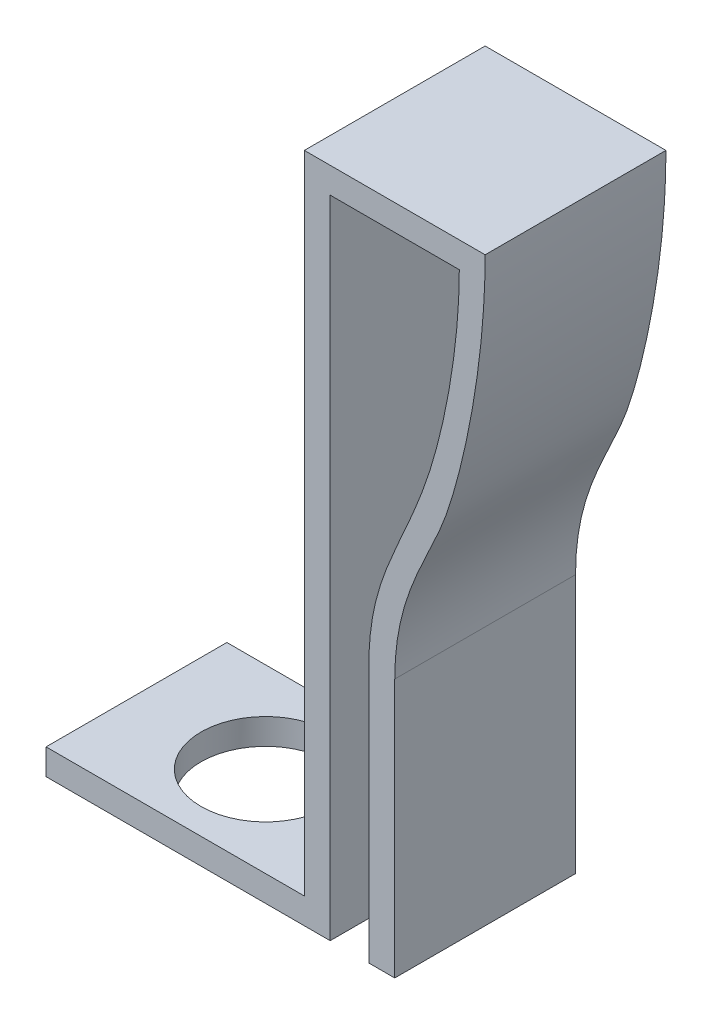
ISO-10303-21;
HEADER;
FILE_DESCRIPTION(('STEP AP214'),'2;1');
FILE_NAME('part.step','',(''),(''),'','','');
FILE_SCHEMA(('AUTOMOTIVE_DESIGN { 1 0 10303 214 1 1 1 1 }'));
ENDSEC;
DATA;
#1=APPLICATION_CONTEXT('core data for automotive mechanical design processes');
#2=APPLICATION_PROTOCOL_DEFINITION('international standard','automotive_design',2000,#1);
#3=PRODUCT_CONTEXT('',#1,'mechanical');
#4=PRODUCT('Part','Part','',(#3));
#5=PRODUCT_RELATED_PRODUCT_CATEGORY('part','',(#4));
#6=PRODUCT_DEFINITION_FORMATION('','',#4);
#7=PRODUCT_DEFINITION_CONTEXT('part definition',#1,'design');
#8=PRODUCT_DEFINITION('design','',#6,#7);
#9=PRODUCT_DEFINITION_SHAPE('','',#8);
#10=(LENGTH_UNIT() NAMED_UNIT(*) SI_UNIT(.MILLI.,.METRE.));
#11=(NAMED_UNIT(*) PLANE_ANGLE_UNIT() SI_UNIT($,.RADIAN.));
#12=(NAMED_UNIT(*) SI_UNIT($,.STERADIAN.) SOLID_ANGLE_UNIT());
#13=UNCERTAINTY_MEASURE_WITH_UNIT(LENGTH_MEASURE(1.E-05),#10,'distance_accuracy_value','');
#14=(GEOMETRIC_REPRESENTATION_CONTEXT(3) GLOBAL_UNCERTAINTY_ASSIGNED_CONTEXT((#13)) GLOBAL_UNIT_ASSIGNED_CONTEXT((#10,
#11,#12)) REPRESENTATION_CONTEXT('',''));
#15=CARTESIAN_POINT('',(0.,0.,0.));
#16=DIRECTION('',(0.,0.,1.));
#17=DIRECTION('',(1.,0.,0.));
#18=AXIS2_PLACEMENT_3D('',#15,#16,#17);
#19=CARTESIAN_POINT('',(0.,0.,7.));
#20=DIRECTION('',(-1.,0.,0.));
#21=DIRECTION('',(0.,0.,1.));
#22=AXIS2_PLACEMENT_3D('',#19,#20,#21);
#23=PLANE('',#22);
#24=DIRECTION('',(0.,1.,0.));
#25=VECTOR('',#24,1.);
#26=CARTESIAN_POINT('',(0.,0.,0.));
#27=LINE('',#26,#25);
#28=CARTESIAN_POINT('',(0.,0.,0.));
#29=VERTEX_POINT('',#28);
#30=CARTESIAN_POINT('',(0.,25.,0.));
#31=VERTEX_POINT('',#30);
#32=EDGE_CURVE('E158',#29,#31,#27,.T.);
#33=ORIENTED_EDGE('',*,*,#32,.T.);
#34=DIRECTION('',(0.,0.,-1.));
#35=VECTOR('',#34,1.);
#36=CARTESIAN_POINT('',(0.,25.,7.));
#37=LINE('',#36,#35);
#38=CARTESIAN_POINT('',(0.,25.,7.));
#39=VERTEX_POINT('',#38);
#40=EDGE_CURVE('E42',#39,#31,#37,.T.);
#41=ORIENTED_EDGE('',*,*,#40,.F.);
#42=DIRECTION('',(0.,1.,0.));
#43=VECTOR('',#42,1.);
#44=CARTESIAN_POINT('',(0.,0.,7.));
#45=LINE('',#44,#43);
#46=CARTESIAN_POINT('',(0.,0.,7.));
#47=VERTEX_POINT('',#46);
#48=EDGE_CURVE('E106',#47,#39,#45,.T.);
#49=ORIENTED_EDGE('',*,*,#48,.F.);
#50=DIRECTION('',(0.,0.,-1.));
#51=VECTOR('',#50,1.);
#52=CARTESIAN_POINT('',(0.,0.,7.));
#53=LINE('',#52,#51);
#54=EDGE_CURVE('E11',#47,#29,#53,.T.);
#55=ORIENTED_EDGE('',*,*,#54,.T.);
#56=EDGE_LOOP('',(#33,#41,#49,#55));
#57=FACE_BOUND('',#56,.T.);
#58=ADVANCED_FACE('F33',(#57),#23,.F.);
#59=CARTESIAN_POINT('',(0.,25.,7.));
#60=DIRECTION('',(0.,1.,0.));
#61=DIRECTION('',(0.,0.,1.));
#62=AXIS2_PLACEMENT_3D('',#59,#60,#61);
#63=PLANE('',#62);
#64=DIRECTION('',(1.,0.,0.));
#65=VECTOR('',#64,1.);
#66=CARTESIAN_POINT('',(0.,25.,0.));
#67=LINE('',#66,#65);
#68=CARTESIAN_POINT('',(5.,25.,0.));
#69=VERTEX_POINT('',#68);
#70=EDGE_CURVE('E160',#31,#69,#67,.T.);
#71=ORIENTED_EDGE('',*,*,#70,.T.);
#72=DIRECTION('',(0.,0.,-1.));
#73=VECTOR('',#72,1.);
#74=CARTESIAN_POINT('',(5.,25.,7.));
#75=LINE('',#74,#73);
#76=CARTESIAN_POINT('',(5.,25.,7.));
#77=VERTEX_POINT('',#76);
#78=EDGE_CURVE('E207',#77,#69,#75,.T.);
#79=ORIENTED_EDGE('',*,*,#78,.F.);
#80=DIRECTION('',(1.,0.,0.));
#81=VECTOR('',#80,1.);
#82=CARTESIAN_POINT('',(0.,25.,7.));
#83=LINE('',#82,#81);
#84=EDGE_CURVE('E216',#39,#77,#83,.T.);
#85=ORIENTED_EDGE('',*,*,#84,.F.);
#86=ORIENTED_EDGE('',*,*,#40,.T.);
#87=EDGE_LOOP('',(#71,#79,#85,#86));
#88=FACE_BOUND('',#87,.T.);
#89=ADVANCED_FACE('F214',(#88),#63,.F.);
#90=CARTESIAN_POINT('',(5.,25.,7.));
#91=CARTESIAN_POINT('',(5.,22.5051608538864,7.));
#92=CARTESIAN_POINT('',(3.77515363716571,15.5440274872174,7.));
#93=CARTESIAN_POINT('',(1.5,13.1602402129723,7.));
#94=CARTESIAN_POINT('',(1.5,10.,7.));
#95=B_SPLINE_CURVE_WITH_KNOTS('',3,(#90,#91,#92,#93,#94),.UNSPECIFIED.,.F.,.F.,(4,1,4),(0.,
0.413095147680513,1.),.UNSPECIFIED.);
#96=DIRECTION('',(0.,0.,-1.));
#97=VECTOR('',#96,1.);
#98=SURFACE_OF_LINEAR_EXTRUSION('',#95,#97);
#99=CARTESIAN_POINT('',(5.,25.,0.));
#100=CARTESIAN_POINT('',(5.,22.5051608538864,0.));
#101=CARTESIAN_POINT('',(3.77515363716571,15.5440274872174,0.));
#102=CARTESIAN_POINT('',(1.5,13.1602402129723,0.));
#103=CARTESIAN_POINT('',(1.5,10.,0.));
#104=B_SPLINE_CURVE_WITH_KNOTS('',3,(#99,#100,#101,#102,#103),.UNSPECIFIED.,.F.,.F.,(4,1,4),(0.,
0.413095147680513,1.),.UNSPECIFIED.);
#105=CARTESIAN_POINT('',(1.5,10.,0.));
#106=VERTEX_POINT('',#105);
#107=EDGE_CURVE('E162',#69,#106,#104,.T.);
#108=ORIENTED_EDGE('',*,*,#107,.T.);
#109=DIRECTION('',(0.,0.,-1.));
#110=VECTOR('',#109,1.);
#111=CARTESIAN_POINT('',(1.5,10.,7.));
#112=LINE('',#111,#110);
#113=CARTESIAN_POINT('',(1.5,10.,7.));
#114=VERTEX_POINT('',#113);
#115=EDGE_CURVE('E204',#114,#106,#112,.T.);
#116=ORIENTED_EDGE('',*,*,#115,.F.);
#117=EDGE_CURVE('E235',#77,#114,#95,.T.);
#118=ORIENTED_EDGE('',*,*,#117,.F.);
#119=ORIENTED_EDGE('',*,*,#78,.T.);
#120=EDGE_LOOP('',(#108,#116,#118,#119));
#121=FACE_BOUND('',#120,.T.);
#122=ADVANCED_FACE('F226',(#121),#98,.F.);
#123=CARTESIAN_POINT('',(1.5,0.,7.));
#124=DIRECTION('',(1.,0.,0.));
#125=DIRECTION('',(0.,0.,-1.));
#126=AXIS2_PLACEMENT_3D('',#123,#124,#125);
#127=PLANE('',#126);
#128=DIRECTION('',(0.,-1.,0.));
#129=VECTOR('',#128,1.);
#130=CARTESIAN_POINT('',(1.5,0.,0.));
#131=LINE('',#130,#129);
#132=CARTESIAN_POINT('',(1.5,0.,0.));
#133=VERTEX_POINT('',#132);
#134=EDGE_CURVE('E166',#106,#133,#131,.T.);
#135=ORIENTED_EDGE('',*,*,#134,.T.);
#136=DIRECTION('',(0.,0.,-1.));
#137=VECTOR('',#136,1.);
#138=CARTESIAN_POINT('',(1.5,0.,7.));
#139=LINE('',#138,#137);
#140=CARTESIAN_POINT('',(1.5,0.,7.));
#141=VERTEX_POINT('',#140);
#142=EDGE_CURVE('E201',#141,#133,#139,.T.);
#143=ORIENTED_EDGE('',*,*,#142,.F.);
#144=DIRECTION('',(0.,-1.,0.));
#145=VECTOR('',#144,1.);
#146=CARTESIAN_POINT('',(1.5,0.,7.));
#147=LINE('',#146,#145);
#148=EDGE_CURVE('E232',#114,#141,#147,.T.);
#149=ORIENTED_EDGE('',*,*,#148,.F.);
#150=ORIENTED_EDGE('',*,*,#115,.T.);
#151=EDGE_LOOP('',(#135,#143,#149,#150));
#152=FACE_BOUND('',#151,.T.);
#153=ADVANCED_FACE('F230',(#152),#127,.F.);
#154=CARTESIAN_POINT('',(1.5,0.,7.));
#155=DIRECTION('',(0.,1.,0.));
#156=DIRECTION('',(0.,0.,1.));
#157=AXIS2_PLACEMENT_3D('',#154,#155,#156);
#158=PLANE('',#157);
#159=DIRECTION('',(1.,0.,0.));
#160=VECTOR('',#159,1.);
#161=CARTESIAN_POINT('',(1.5,0.,0.));
#162=LINE('',#161,#160);
#163=CARTESIAN_POINT('',(2.5,0.,0.));
#164=VERTEX_POINT('',#163);
#165=EDGE_CURVE('E171',#133,#164,#162,.T.);
#166=ORIENTED_EDGE('',*,*,#165,.T.);
#167=DIRECTION('',(0.,0.,-1.));
#168=VECTOR('',#167,1.);
#169=CARTESIAN_POINT('',(2.5,0.,7.));
#170=LINE('',#169,#168);
#171=CARTESIAN_POINT('',(2.5,0.,7.));
#172=VERTEX_POINT('',#171);
#173=EDGE_CURVE('E198',#172,#164,#170,.T.);
#174=ORIENTED_EDGE('',*,*,#173,.F.);
#175=DIRECTION('',(1.,0.,0.));
#176=VECTOR('',#175,1.);
#177=CARTESIAN_POINT('',(1.5,0.,7.));
#178=LINE('',#177,#176);
#179=EDGE_CURVE('E234',#141,#172,#178,.T.);
#180=ORIENTED_EDGE('',*,*,#179,.F.);
#181=ORIENTED_EDGE('',*,*,#142,.T.);
#182=EDGE_LOOP('',(#166,#174,#180,#181));
#183=FACE_BOUND('',#182,.T.);
#184=ADVANCED_FACE('F264',(#183),#158,.F.);
#185=CARTESIAN_POINT('',(2.5,0.,7.));
#186=DIRECTION('',(-1.,0.,0.));
#187=DIRECTION('',(0.,0.,1.));
#188=AXIS2_PLACEMENT_3D('',#185,#186,#187);
#189=PLANE('',#188);
#190=DIRECTION('',(0.,1.,0.));
#191=VECTOR('',#190,1.);
#192=CARTESIAN_POINT('',(2.5,0.,0.));
#193=LINE('',#192,#191);
#194=CARTESIAN_POINT('',(2.5,10.0239728072315,0.));
#195=VERTEX_POINT('',#194);
#196=EDGE_CURVE('E173',#164,#195,#193,.T.);
#197=ORIENTED_EDGE('',*,*,#196,.T.);
#198=DIRECTION('',(0.,0.,-1.));
#199=VECTOR('',#198,1.);
#200=CARTESIAN_POINT('',(2.5,10.0239728072315,7.));
#201=LINE('',#200,#199);
#202=CARTESIAN_POINT('',(2.5,10.0239728072315,7.));
#203=VERTEX_POINT('',#202);
#204=EDGE_CURVE('E195',#203,#195,#201,.T.);
#205=ORIENTED_EDGE('',*,*,#204,.F.);
#206=DIRECTION('',(0.,1.,0.));
#207=VECTOR('',#206,1.);
#208=CARTESIAN_POINT('',(2.5,0.,7.));
#209=LINE('',#208,#207);
#210=EDGE_CURVE('E237',#172,#203,#209,.T.);
#211=ORIENTED_EDGE('',*,*,#210,.F.);
#212=ORIENTED_EDGE('',*,*,#173,.T.);
#213=EDGE_LOOP('',(#197,#205,#211,#212));
#214=FACE_BOUND('',#213,.T.);
#215=ADVANCED_FACE('F259',(#214),#189,.F.);
#216=CARTESIAN_POINT('',(2.5,10.0239728072315,7.));
#217=CARTESIAN_POINT('',(2.5,12.6969260185003,7.));
#218=CARTESIAN_POINT('',(3.79077686643129,14.6525962398853,7.));
#219=CARTESIAN_POINT('',(5.04127526822333,17.9714001978499,7.));
#220=CARTESIAN_POINT('',(6.,22.3223853433308,7.));
#221=CARTESIAN_POINT('',(6.,26.,7.));
#222=B_SPLINE_CURVE_WITH_KNOTS('',3,(#216,#217,#218,#219,#220,#221),.UNSPECIFIED.,.F.,.F.,(4,1,
1,4),(0.,0.473306407513653,0.573306407513653,1.),.UNSPECIFIED.);
#223=DIRECTION('',(0.,0.,-1.));
#224=VECTOR('',#223,1.);
#225=SURFACE_OF_LINEAR_EXTRUSION('',#222,#224);
#226=CARTESIAN_POINT('',(2.5,10.0239728072315,0.));
#227=CARTESIAN_POINT('',(2.5,12.6969260185003,0.));
#228=CARTESIAN_POINT('',(3.79077686643129,14.6525962398853,0.));
#229=CARTESIAN_POINT('',(5.04127526822333,17.9714001978499,0.));
#230=CARTESIAN_POINT('',(6.,22.3223853433308,0.));
#231=CARTESIAN_POINT('',(6.,26.,0.));
#232=B_SPLINE_CURVE_WITH_KNOTS('',3,(#226,#227,#228,#229,#230,#231),.UNSPECIFIED.,.F.,.F.,(4,1,
1,4),(0.,0.473306407513653,0.573306407513653,1.),.UNSPECIFIED.);
#233=CARTESIAN_POINT('',(6.,26.,0.));
#234=VERTEX_POINT('',#233);
#235=EDGE_CURVE('E175',#195,#234,#232,.T.);
#236=ORIENTED_EDGE('',*,*,#235,.T.);
#237=DIRECTION('',(0.,0.,-1.));
#238=VECTOR('',#237,1.);
#239=CARTESIAN_POINT('',(6.,26.,7.));
#240=LINE('',#239,#238);
#241=CARTESIAN_POINT('',(6.,26.,7.));
#242=VERTEX_POINT('',#241);
#243=EDGE_CURVE('E192',#242,#234,#240,.T.);
#244=ORIENTED_EDGE('',*,*,#243,.F.);
#245=EDGE_CURVE('E246',#203,#242,#222,.T.);
#246=ORIENTED_EDGE('',*,*,#245,.F.);
#247=ORIENTED_EDGE('',*,*,#204,.T.);
#248=EDGE_LOOP('',(#236,#244,#246,#247));
#249=FACE_BOUND('',#248,.T.);
#250=ADVANCED_FACE('F254',(#249),#225,.F.);
#251=CARTESIAN_POINT('',(-1.,26.,7.));
#252=DIRECTION('',(0.,-1.,0.));
#253=DIRECTION('',(0.,0.,-1.));
#254=AXIS2_PLACEMENT_3D('',#251,#252,#253);
#255=PLANE('',#254);
#256=DIRECTION('',(-1.,0.,0.));
#257=VECTOR('',#256,1.);
#258=CARTESIAN_POINT('',(-1.,26.,0.));
#259=LINE('',#258,#257);
#260=CARTESIAN_POINT('',(-1.,26.,0.));
#261=VERTEX_POINT('',#260);
#262=EDGE_CURVE('E179',#234,#261,#259,.T.);
#263=ORIENTED_EDGE('',*,*,#262,.T.);
#264=DIRECTION('',(0.,0.,-1.));
#265=VECTOR('',#264,1.);
#266=CARTESIAN_POINT('',(-1.,26.,7.));
#267=LINE('',#266,#265);
#268=CARTESIAN_POINT('',(-1.,26.,7.));
#269=VERTEX_POINT('',#268);
#270=EDGE_CURVE('E147',#269,#261,#267,.T.);
#271=ORIENTED_EDGE('',*,*,#270,.F.);
#272=DIRECTION('',(-1.,0.,0.));
#273=VECTOR('',#272,1.);
#274=CARTESIAN_POINT('',(-1.,26.,7.));
#275=LINE('',#274,#273);
#276=EDGE_CURVE('E138',#242,#269,#275,.T.);
#277=ORIENTED_EDGE('',*,*,#276,.F.);
#278=ORIENTED_EDGE('',*,*,#243,.T.);
#279=EDGE_LOOP('',(#263,#271,#277,#278));
#280=FACE_BOUND('',#279,.T.);
#281=ADVANCED_FACE('F258',(#280),#255,.F.);
#282=CARTESIAN_POINT('',(-1.,26.,7.));
#283=DIRECTION('',(1.,0.,0.));
#284=DIRECTION('',(0.,0.,-1.));
#285=AXIS2_PLACEMENT_3D('',#282,#283,#284);
#286=PLANE('',#285);
#287=DIRECTION('',(0.,-1.,0.));
#288=VECTOR('',#287,1.);
#289=CARTESIAN_POINT('',(-1.,26.,0.));
#290=LINE('',#289,#288);
#291=CARTESIAN_POINT('',(-1.,0.999999999999999,0.));
#292=VERTEX_POINT('',#291);
#293=EDGE_CURVE('E146',#261,#292,#290,.T.);
#294=ORIENTED_EDGE('',*,*,#293,.T.);
#295=DIRECTION('',(0.,0.,-1.));
#296=VECTOR('',#295,1.);
#297=CARTESIAN_POINT('',(-1.,0.999999999999999,7.));
#298=LINE('',#297,#296);
#299=CARTESIAN_POINT('',(-1.,0.999999999999999,7.));
#300=VERTEX_POINT('',#299);
#301=EDGE_CURVE('E143',#300,#292,#298,.T.);
#302=ORIENTED_EDGE('',*,*,#301,.F.);
#303=DIRECTION('',(0.,-1.,0.));
#304=VECTOR('',#303,1.);
#305=CARTESIAN_POINT('',(-1.,26.,7.));
#306=LINE('',#305,#304);
#307=EDGE_CURVE('E132',#269,#300,#306,.T.);
#308=ORIENTED_EDGE('',*,*,#307,.F.);
#309=ORIENTED_EDGE('',*,*,#270,.T.);
#310=EDGE_LOOP('',(#294,#302,#308,#309));
#311=FACE_BOUND('',#310,.T.);
#312=ADVANCED_FACE('F144',(#311),#286,.F.);
#313=CARTESIAN_POINT('',(-11.,0.999999999999999,7.));
#314=DIRECTION('',(0.,-1.,0.));
#315=DIRECTION('',(0.,0.,-1.));
#316=AXIS2_PLACEMENT_3D('',#313,#314,#315);
#317=PLANE('',#316);
#318=CARTESIAN_POINT('',(-6.,0.999999999999999,3.5));
#319=DIRECTION('',(0.,1.,0.));
#320=DIRECTION('',(0.,0.,1.));
#321=AXIS2_PLACEMENT_3D('',#318,#319,#320);
#322=CIRCLE('',#321,2.5);
#323=CARTESIAN_POINT('',(-6.,0.999999999999999,6.));
#324=VERTEX_POINT('',#323);
#325=EDGE_CURVE('E316',#324,#324,#322,.T.);
#326=ORIENTED_EDGE('',*,*,#325,.F.);
#327=EDGE_LOOP('',(#326));
#328=FACE_BOUND('',#327,.T.);
#329=DIRECTION('',(-1.,0.,0.));
#330=VECTOR('',#329,1.);
#331=CARTESIAN_POINT('',(-11.,0.999999999999999,0.));
#332=LINE('',#331,#330);
#333=CARTESIAN_POINT('',(-11.,0.999999999999999,0.));
#334=VERTEX_POINT('',#333);
#335=EDGE_CURVE('E92',#292,#334,#332,.T.);
#336=ORIENTED_EDGE('',*,*,#335,.T.);
#337=DIRECTION('',(0.,0.,-1.));
#338=VECTOR('',#337,1.);
#339=CARTESIAN_POINT('',(-11.,0.999999999999999,7.));
#340=LINE('',#339,#338);
#341=CARTESIAN_POINT('',(-11.,0.999999999999999,7.));
#342=VERTEX_POINT('',#341);
#343=EDGE_CURVE('E148',#342,#334,#340,.T.);
#344=ORIENTED_EDGE('',*,*,#343,.F.);
#345=DIRECTION('',(-1.,0.,0.));
#346=VECTOR('',#345,1.);
#347=CARTESIAN_POINT('',(-11.,0.999999999999999,7.));
#348=LINE('',#347,#346);
#349=EDGE_CURVE('E136',#300,#342,#348,.T.);
#350=ORIENTED_EDGE('',*,*,#349,.F.);
#351=ORIENTED_EDGE('',*,*,#301,.T.);
#352=EDGE_LOOP('',(#336,#344,#350,#351));
#353=FACE_BOUND('',#352,.T.);
#354=ADVANCED_FACE('F150',(#328,#353),#317,.F.);
#355=CARTESIAN_POINT('',(-11.,0.,7.));
#356=DIRECTION('',(1.,0.,0.));
#357=DIRECTION('',(0.,0.,-1.));
#358=AXIS2_PLACEMENT_3D('',#355,#356,#357);
#359=PLANE('',#358);
#360=DIRECTION('',(0.,-1.,0.));
#361=VECTOR('',#360,1.);
#362=CARTESIAN_POINT('',(-11.,0.,0.));
#363=LINE('',#362,#361);
#364=CARTESIAN_POINT('',(-11.,0.,0.));
#365=VERTEX_POINT('',#364);
#366=EDGE_CURVE('E99',#334,#365,#363,.T.);
#367=ORIENTED_EDGE('',*,*,#366,.T.);
#368=DIRECTION('',(0.,0.,-1.));
#369=VECTOR('',#368,1.);
#370=CARTESIAN_POINT('',(-11.,0.,7.));
#371=LINE('',#370,#369);
#372=CARTESIAN_POINT('',(-11.,0.,7.));
#373=VERTEX_POINT('',#372);
#374=EDGE_CURVE('E154',#373,#365,#371,.T.);
#375=ORIENTED_EDGE('',*,*,#374,.F.);
#376=DIRECTION('',(0.,-1.,0.));
#377=VECTOR('',#376,1.);
#378=CARTESIAN_POINT('',(-11.,0.,7.));
#379=LINE('',#378,#377);
#380=EDGE_CURVE('E152',#342,#373,#379,.T.);
#381=ORIENTED_EDGE('',*,*,#380,.F.);
#382=ORIENTED_EDGE('',*,*,#343,.T.);
#383=EDGE_LOOP('',(#367,#375,#381,#382));
#384=FACE_BOUND('',#383,.T.);
#385=ADVANCED_FACE('F295',(#384),#359,.F.);
#386=CARTESIAN_POINT('',(-1.,0.,7.));
#387=DIRECTION('',(0.,1.,0.));
#388=DIRECTION('',(-1.,0.,0.));
#389=AXIS2_PLACEMENT_3D('',#386,#387,#388);
#390=PLANE('',#389);
#391=CARTESIAN_POINT('',(-6.,0.,3.5));
#392=DIRECTION('',(0.,1.,0.));
#393=DIRECTION('',(-1.,0.,0.));
#394=AXIS2_PLACEMENT_3D('',#391,#392,#393);
#395=CIRCLE('',#394,2.5);
#396=CARTESIAN_POINT('',(-8.5,0.,3.5));
#397=VERTEX_POINT('',#396);
#398=EDGE_CURVE('E36',#397,#397,#395,.T.);
#399=ORIENTED_EDGE('',*,*,#398,.T.);
#400=EDGE_LOOP('',(#399));
#401=FACE_BOUND('',#400,.T.);
#402=DIRECTION('',(1.,0.,0.));
#403=VECTOR('',#402,1.);
#404=CARTESIAN_POINT('',(-1.,0.,0.));
#405=LINE('',#404,#403);
#406=EDGE_CURVE('E187',#365,#29,#405,.T.);
#407=ORIENTED_EDGE('',*,*,#406,.T.);
#408=ORIENTED_EDGE('',*,*,#54,.F.);
#409=DIRECTION('',(1.,0.,0.));
#410=VECTOR('',#409,1.);
#411=CARTESIAN_POINT('',(0.,0.,7.));
#412=LINE('',#411,#410);
#413=EDGE_CURVE('E50',#373,#47,#412,.T.);
#414=ORIENTED_EDGE('',*,*,#413,.F.);
#415=ORIENTED_EDGE('',*,*,#374,.T.);
#416=EDGE_LOOP('',(#407,#408,#414,#415));
#417=FACE_BOUND('',#416,.T.);
#418=ADVANCED_FACE('F278',(#401,#417),#390,.F.);
#419=CARTESIAN_POINT('',(4.35106466398366,16.1584492061507,7.));
#420=DIRECTION('',(0.,0.,1.));
#421=DIRECTION('',(1.,0.,0.));
#422=AXIS2_PLACEMENT_3D('',#419,#420,#421);
#423=PLANE('',#422);
#424=ORIENTED_EDGE('',*,*,#413,.T.);
#425=ORIENTED_EDGE('',*,*,#48,.T.);
#426=ORIENTED_EDGE('',*,*,#84,.T.);
#427=ORIENTED_EDGE('',*,*,#117,.T.);
#428=ORIENTED_EDGE('',*,*,#148,.T.);
#429=ORIENTED_EDGE('',*,*,#179,.T.);
#430=ORIENTED_EDGE('',*,*,#210,.T.);
#431=ORIENTED_EDGE('',*,*,#245,.T.);
#432=ORIENTED_EDGE('',*,*,#276,.T.);
#433=ORIENTED_EDGE('',*,*,#307,.T.);
#434=ORIENTED_EDGE('',*,*,#349,.T.);
#435=ORIENTED_EDGE('',*,*,#380,.T.);
#436=EDGE_LOOP('',(#424,#425,#426,#427,#428,#429,#430,#431,#432,#433,#434,#435));
#437=FACE_BOUND('',#436,.T.);
#438=ADVANCED_FACE('F134',(#437),#423,.T.);
#439=CARTESIAN_POINT('',(4.35106466398366,16.1584492061507,0.));
#440=DIRECTION('',(0.,0.,1.));
#441=DIRECTION('',(1.,0.,0.));
#442=AXIS2_PLACEMENT_3D('',#439,#440,#441);
#443=PLANE('',#442);
#444=ORIENTED_EDGE('',*,*,#32,.F.);
#445=ORIENTED_EDGE('',*,*,#406,.F.);
#446=ORIENTED_EDGE('',*,*,#366,.F.);
#447=ORIENTED_EDGE('',*,*,#335,.F.);
#448=ORIENTED_EDGE('',*,*,#293,.F.);
#449=ORIENTED_EDGE('',*,*,#262,.F.);
#450=ORIENTED_EDGE('',*,*,#235,.F.);
#451=ORIENTED_EDGE('',*,*,#196,.F.);
#452=ORIENTED_EDGE('',*,*,#165,.F.);
#453=ORIENTED_EDGE('',*,*,#134,.F.);
#454=ORIENTED_EDGE('',*,*,#107,.F.);
#455=ORIENTED_EDGE('',*,*,#70,.F.);
#456=EDGE_LOOP('',(#444,#445,#446,#447,#448,#449,#450,#451,#452,#453,#454,#455));
#457=FACE_BOUND('',#456,.T.);
#458=ADVANCED_FACE('F220',(#457),#443,.F.);
#459=CARTESIAN_POINT('',(-6.,-6.,3.5));
#460=DIRECTION('',(0.,1.,0.));
#461=DIRECTION('',(0.,0.,1.));
#462=AXIS2_PLACEMENT_3D('',#459,#460,#461);
#463=CYLINDRICAL_SURFACE('',#462,2.5);
#464=ORIENTED_EDGE('',*,*,#325,.T.);
#465=EDGE_LOOP('',(#464));
#466=FACE_BOUND('',#465,.T.);
#467=ORIENTED_EDGE('',*,*,#398,.F.);
#468=EDGE_LOOP('',(#467));
#469=FACE_BOUND('',#468,.T.);
#470=ADVANCED_FACE('F306',(#466,#469),#463,.F.);
#471=CLOSED_SHELL('',(#58,#89,#122,#153,#184,#215,#250,#281,#312,#354,#385,#418,#438,#458,#470));
#472=MANIFOLD_SOLID_BREP('B2',#471);
#473=ADVANCED_BREP_SHAPE_REPRESENTATION('',(#18,#472),#14);
#474=SHAPE_DEFINITION_REPRESENTATION(#9,#473);
ENDSEC;
END-ISO-10303-21;
